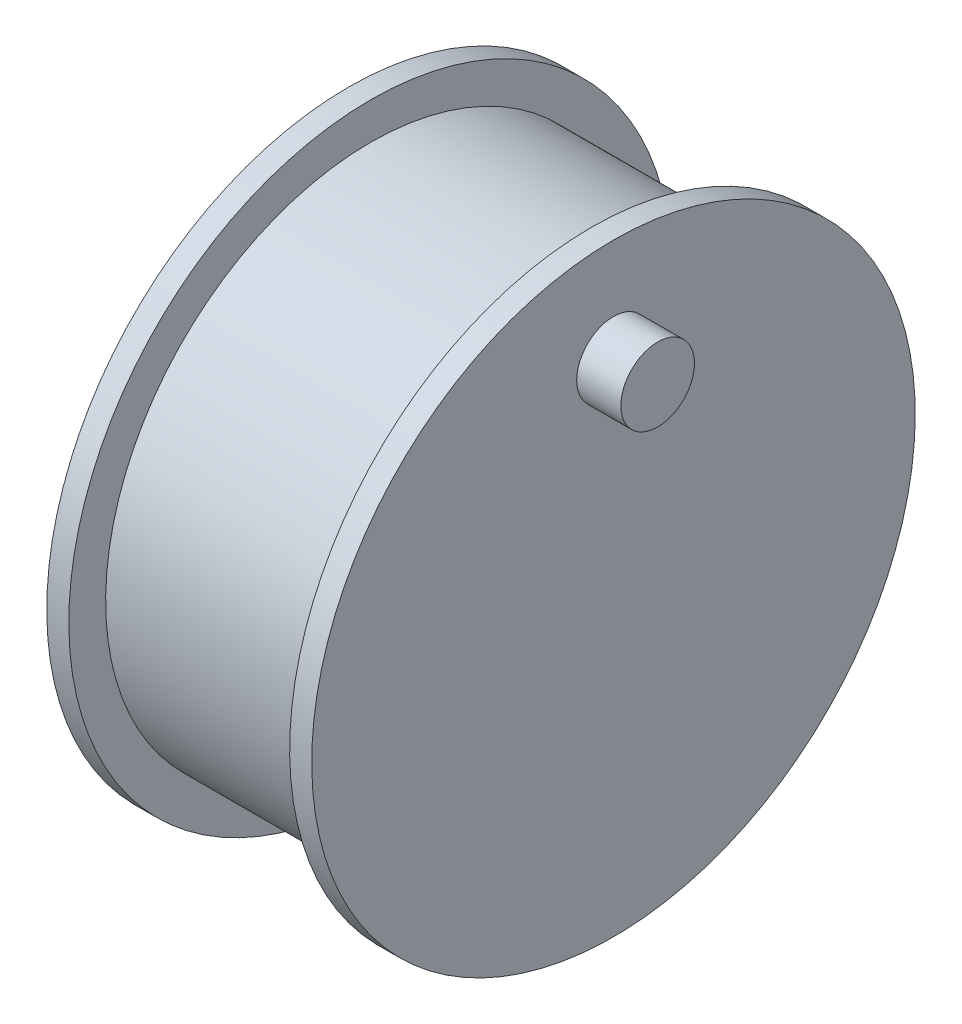
ISO-10303-21;
HEADER;
FILE_DESCRIPTION(('STEP AP214'),'2;1');
FILE_NAME('part.step','',(''),(''),'','','');
FILE_SCHEMA(('AUTOMOTIVE_DESIGN { 1 0 10303 214 1 1 1 1 }'));
ENDSEC;
DATA;
#1=APPLICATION_CONTEXT('core data for automotive mechanical design processes');
#2=APPLICATION_PROTOCOL_DEFINITION('international standard','automotive_design',2000,#1);
#3=PRODUCT_CONTEXT('',#1,'mechanical');
#4=PRODUCT('Part','Part','',(#3));
#5=PRODUCT_RELATED_PRODUCT_CATEGORY('part','',(#4));
#6=PRODUCT_DEFINITION_FORMATION('','',#4);
#7=PRODUCT_DEFINITION_CONTEXT('part definition',#1,'design');
#8=PRODUCT_DEFINITION('design','',#6,#7);
#9=PRODUCT_DEFINITION_SHAPE('','',#8);
#10=(LENGTH_UNIT() NAMED_UNIT(*) SI_UNIT(.MILLI.,.METRE.));
#11=(NAMED_UNIT(*) PLANE_ANGLE_UNIT() SI_UNIT($,.RADIAN.));
#12=(NAMED_UNIT(*) SI_UNIT($,.STERADIAN.) SOLID_ANGLE_UNIT());
#13=UNCERTAINTY_MEASURE_WITH_UNIT(LENGTH_MEASURE(1.E-05),#10,'distance_accuracy_value','');
#14=(GEOMETRIC_REPRESENTATION_CONTEXT(3) GLOBAL_UNCERTAINTY_ASSIGNED_CONTEXT((#13)) GLOBAL_UNIT_ASSIGNED_CONTEXT((#10,
#11,#12)) REPRESENTATION_CONTEXT('',''));
#15=CARTESIAN_POINT('',(0.,0.,0.));
#16=DIRECTION('',(0.,0.,1.));
#17=DIRECTION('',(1.,0.,0.));
#18=AXIS2_PLACEMENT_3D('',#15,#16,#17);
#19=CARTESIAN_POINT('',(9.,20.5,0.));
#20=DIRECTION('',(1.,0.,0.));
#21=DIRECTION('',(0.,1.,0.));
#22=AXIS2_PLACEMENT_3D('',#19,#20,#21);
#23=PLANE('',#22);
#24=CARTESIAN_POINT('',(9.,13.5,0.));
#25=DIRECTION('',(1.,0.,0.));
#26=DIRECTION('',(0.,1.,0.));
#27=AXIS2_PLACEMENT_3D('',#24,#25,#26);
#28=CIRCLE('',#27,2.5);
#29=CARTESIAN_POINT('',(9.,16.,0.));
#30=VERTEX_POINT('',#29);
#31=EDGE_CURVE('E73',#30,#30,#28,.T.);
#32=ORIENTED_EDGE('',*,*,#31,.F.);
#33=EDGE_LOOP('',(#32));
#34=FACE_BOUND('',#33,.T.);
#35=CARTESIAN_POINT('',(9.,0.,0.));
#36=DIRECTION('',(1.,0.,0.));
#37=DIRECTION('',(0.,1.,0.));
#38=AXIS2_PLACEMENT_3D('',#35,#36,#37);
#39=CIRCLE('',#38,20.5);
#40=CARTESIAN_POINT('',(9.,20.5,0.));
#41=VERTEX_POINT('',#40);
#42=EDGE_CURVE('E68',#41,#41,#39,.T.);
#43=ORIENTED_EDGE('',*,*,#42,.T.);
#44=EDGE_LOOP('',(#43));
#45=FACE_BOUND('',#44,.T.);
#46=ADVANCED_FACE('F41',(#34,#45),#23,.T.);
#47=CARTESIAN_POINT('',(-9.,0.,0.));
#48=DIRECTION('',(-1.,0.,0.));
#49=DIRECTION('',(0.,-1.,0.));
#50=AXIS2_PLACEMENT_3D('',#47,#48,#49);
#51=PLANE('',#50);
#52=CARTESIAN_POINT('',(-9.,0.,0.));
#53=DIRECTION('',(1.,0.,0.));
#54=DIRECTION('',(0.,1.,0.));
#55=AXIS2_PLACEMENT_3D('',#52,#53,#54);
#56=CIRCLE('',#55,20.5);
#57=CARTESIAN_POINT('',(-9.,20.5,0.));
#58=VERTEX_POINT('',#57);
#59=EDGE_CURVE('E10',#58,#58,#56,.T.);
#60=ORIENTED_EDGE('',*,*,#59,.F.);
#61=EDGE_LOOP('',(#60));
#62=FACE_BOUND('',#61,.T.);
#63=ADVANCED_FACE('F92',(#62),#51,.T.);
#64=CARTESIAN_POINT('',(9.,0.,0.));
#65=DIRECTION('',(1.,0.,0.));
#66=DIRECTION('',(0.,1.,0.));
#67=AXIS2_PLACEMENT_3D('',#64,#65,#66);
#68=CYLINDRICAL_SURFACE('',#67,20.5);
#69=ORIENTED_EDGE('',*,*,#59,.T.);
#70=EDGE_LOOP('',(#69));
#71=FACE_BOUND('',#70,.T.);
#72=CARTESIAN_POINT('',(-7.5,0.,0.));
#73=DIRECTION('',(1.,0.,0.));
#74=DIRECTION('',(0.,1.,0.));
#75=AXIS2_PLACEMENT_3D('',#72,#73,#74);
#76=CIRCLE('',#75,20.5);
#77=CARTESIAN_POINT('',(-7.5,20.5,0.));
#78=VERTEX_POINT('',#77);
#79=EDGE_CURVE('E48',#78,#78,#76,.T.);
#80=ORIENTED_EDGE('',*,*,#79,.F.);
#81=EDGE_LOOP('',(#80));
#82=FACE_BOUND('',#81,.T.);
#83=ADVANCED_FACE('F113',(#71,#82),#68,.T.);
#84=CARTESIAN_POINT('',(-7.5,20.5,0.));
#85=DIRECTION('',(1.,0.,0.));
#86=DIRECTION('',(0.,1.,0.));
#87=AXIS2_PLACEMENT_3D('',#84,#85,#86);
#88=PLANE('',#87);
#89=ORIENTED_EDGE('',*,*,#79,.T.);
#90=EDGE_LOOP('',(#89));
#91=FACE_BOUND('',#90,.T.);
#92=CARTESIAN_POINT('',(-7.5,0.,0.));
#93=DIRECTION('',(1.,0.,0.));
#94=DIRECTION('',(0.,1.,0.));
#95=AXIS2_PLACEMENT_3D('',#92,#93,#94);
#96=CIRCLE('',#95,18.);
#97=CARTESIAN_POINT('',(-7.5,18.,0.));
#98=VERTEX_POINT('',#97);
#99=EDGE_CURVE('E53',#98,#98,#96,.T.);
#100=ORIENTED_EDGE('',*,*,#99,.F.);
#101=EDGE_LOOP('',(#100));
#102=FACE_BOUND('',#101,.T.);
#103=ADVANCED_FACE('F109',(#91,#102),#88,.T.);
#104=CARTESIAN_POINT('',(9.,0.,0.));
#105=DIRECTION('',(1.,0.,0.));
#106=DIRECTION('',(0.,1.,0.));
#107=AXIS2_PLACEMENT_3D('',#104,#105,#106);
#108=CYLINDRICAL_SURFACE('',#107,18.);
#109=ORIENTED_EDGE('',*,*,#99,.T.);
#110=EDGE_LOOP('',(#109));
#111=FACE_BOUND('',#110,.T.);
#112=CARTESIAN_POINT('',(7.5,0.,0.));
#113=DIRECTION('',(1.,0.,0.));
#114=DIRECTION('',(0.,1.,0.));
#115=AXIS2_PLACEMENT_3D('',#112,#113,#114);
#116=CIRCLE('',#115,18.);
#117=CARTESIAN_POINT('',(7.5,18.,0.));
#118=VERTEX_POINT('',#117);
#119=EDGE_CURVE('E58',#118,#118,#116,.T.);
#120=ORIENTED_EDGE('',*,*,#119,.F.);
#121=EDGE_LOOP('',(#120));
#122=FACE_BOUND('',#121,.T.);
#123=ADVANCED_FACE('F102',(#111,#122),#108,.T.);
#124=CARTESIAN_POINT('',(7.5,18.,0.));
#125=DIRECTION('',(-1.,0.,0.));
#126=DIRECTION('',(0.,-1.,0.));
#127=AXIS2_PLACEMENT_3D('',#124,#125,#126);
#128=PLANE('',#127);
#129=ORIENTED_EDGE('',*,*,#119,.T.);
#130=EDGE_LOOP('',(#129));
#131=FACE_BOUND('',#130,.T.);
#132=CARTESIAN_POINT('',(7.5,0.,0.));
#133=DIRECTION('',(1.,0.,0.));
#134=DIRECTION('',(0.,1.,0.));
#135=AXIS2_PLACEMENT_3D('',#132,#133,#134);
#136=CIRCLE('',#135,20.5);
#137=CARTESIAN_POINT('',(7.5,20.5,0.));
#138=VERTEX_POINT('',#137);
#139=EDGE_CURVE('E64',#138,#138,#136,.T.);
#140=ORIENTED_EDGE('',*,*,#139,.F.);
#141=EDGE_LOOP('',(#140));
#142=FACE_BOUND('',#141,.T.);
#143=ADVANCED_FACE('F96',(#131,#142),#128,.T.);
#144=CARTESIAN_POINT('',(9.,0.,0.));
#145=DIRECTION('',(1.,0.,0.));
#146=DIRECTION('',(0.,1.,0.));
#147=AXIS2_PLACEMENT_3D('',#144,#145,#146);
#148=CYLINDRICAL_SURFACE('',#147,20.5);
#149=ORIENTED_EDGE('',*,*,#139,.T.);
#150=EDGE_LOOP('',(#149));
#151=FACE_BOUND('',#150,.T.);
#152=ORIENTED_EDGE('',*,*,#42,.F.);
#153=EDGE_LOOP('',(#152));
#154=FACE_BOUND('',#153,.T.);
#155=ADVANCED_FACE('F86',(#151,#154),#148,.T.);
#156=CARTESIAN_POINT('',(12.,13.5,0.));
#157=DIRECTION('',(-1.,0.,0.));
#158=DIRECTION('',(0.,-1.,0.));
#159=AXIS2_PLACEMENT_3D('',#156,#157,#158);
#160=CYLINDRICAL_SURFACE('',#159,2.5);
#161=CARTESIAN_POINT('',(12.,13.5,0.));
#162=DIRECTION('',(1.,0.,0.));
#163=DIRECTION('',(0.,1.,0.));
#164=AXIS2_PLACEMENT_3D('',#161,#162,#163);
#165=CIRCLE('',#164,2.5);
#166=CARTESIAN_POINT('',(12.,16.,0.));
#167=VERTEX_POINT('',#166);
#168=EDGE_CURVE('E72',#167,#167,#165,.T.);
#169=ORIENTED_EDGE('',*,*,#168,.F.);
#170=EDGE_LOOP('',(#169));
#171=FACE_BOUND('',#170,.T.);
#172=ORIENTED_EDGE('',*,*,#31,.T.);
#173=EDGE_LOOP('',(#172));
#174=FACE_BOUND('',#173,.T.);
#175=ADVANCED_FACE('F83',(#171,#174),#160,.T.);
#176=CARTESIAN_POINT('',(12.,13.5,0.));
#177=DIRECTION('',(1.,0.,0.));
#178=DIRECTION('',(0.,1.,0.));
#179=AXIS2_PLACEMENT_3D('',#176,#177,#178);
#180=PLANE('',#179);
#181=ORIENTED_EDGE('',*,*,#168,.T.);
#182=EDGE_LOOP('',(#181));
#183=FACE_BOUND('',#182,.T.);
#184=ADVANCED_FACE('F81',(#183),#180,.T.);
#185=CLOSED_SHELL('',(#46,#63,#83,#103,#123,#143,#155,#175,#184));
#186=MANIFOLD_SOLID_BREP('B2',#185);
#187=ADVANCED_BREP_SHAPE_REPRESENTATION('',(#18,#186),#14);
#188=SHAPE_DEFINITION_REPRESENTATION(#9,#187);
ENDSEC;
END-ISO-10303-21;
